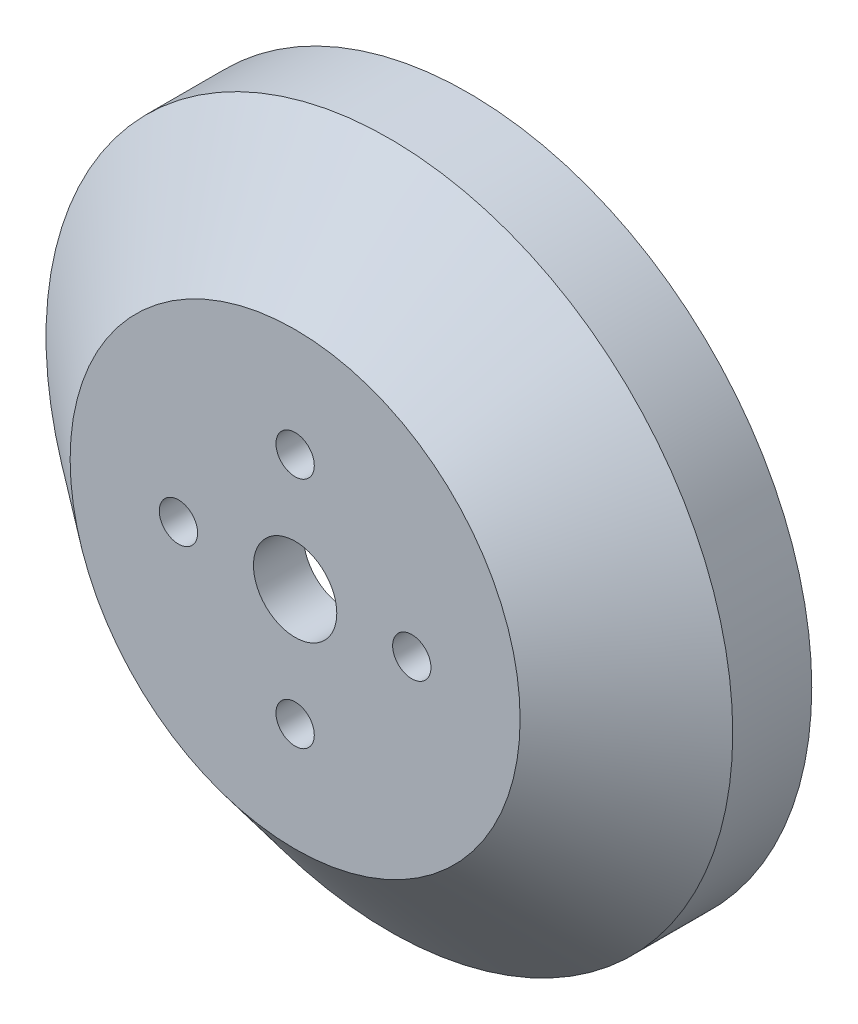
ISO-10303-21;
HEADER;
FILE_DESCRIPTION(('STEP AP214'),'2;1');
FILE_NAME('part.step','',(''),(''),'','','');
FILE_SCHEMA(('AUTOMOTIVE_DESIGN { 1 0 10303 214 1 1 1 1 }'));
ENDSEC;
DATA;
#1=APPLICATION_CONTEXT('core data for automotive mechanical design processes');
#2=APPLICATION_PROTOCOL_DEFINITION('international standard','automotive_design',2000,#1);
#3=PRODUCT_CONTEXT('',#1,'mechanical');
#4=PRODUCT('Part','Part','',(#3));
#5=PRODUCT_RELATED_PRODUCT_CATEGORY('part','',(#4));
#6=PRODUCT_DEFINITION_FORMATION('','',#4);
#7=PRODUCT_DEFINITION_CONTEXT('part definition',#1,'design');
#8=PRODUCT_DEFINITION('design','',#6,#7);
#9=PRODUCT_DEFINITION_SHAPE('','',#8);
#10=(LENGTH_UNIT() NAMED_UNIT(*) SI_UNIT(.MILLI.,.METRE.));
#11=(NAMED_UNIT(*) PLANE_ANGLE_UNIT() SI_UNIT($,.RADIAN.));
#12=(NAMED_UNIT(*) SI_UNIT($,.STERADIAN.) SOLID_ANGLE_UNIT());
#13=UNCERTAINTY_MEASURE_WITH_UNIT(LENGTH_MEASURE(1.E-05),#10,'distance_accuracy_value','');
#14=(GEOMETRIC_REPRESENTATION_CONTEXT(3) GLOBAL_UNCERTAINTY_ASSIGNED_CONTEXT((#13)) GLOBAL_UNIT_ASSIGNED_CONTEXT((#10,
#11,#12)) REPRESENTATION_CONTEXT('',''));
#15=CARTESIAN_POINT('',(0.,0.,0.));
#16=DIRECTION('',(0.,0.,1.));
#17=DIRECTION('',(1.,0.,0.));
#18=AXIS2_PLACEMENT_3D('',#15,#16,#17);
#19=CARTESIAN_POINT('',(0.,0.,3.));
#20=DIRECTION('',(0.,0.,1.));
#21=DIRECTION('',(1.,0.,0.));
#22=AXIS2_PLACEMENT_3D('',#19,#20,#21);
#23=PLANE('',#22);
#24=CARTESIAN_POINT('',(-7.,0.,3.));
#25=DIRECTION('',(0.,0.,1.));
#26=DIRECTION('',(1.,0.,0.));
#27=AXIS2_PLACEMENT_3D('',#24,#25,#26);
#28=CIRCLE('',#27,1.15);
#29=CARTESIAN_POINT('',(-5.85,0.,3.));
#30=VERTEX_POINT('',#29);
#31=EDGE_CURVE('E76',#30,#30,#28,.T.);
#32=ORIENTED_EDGE('',*,*,#31,.F.);
#33=EDGE_LOOP('',(#32));
#34=FACE_BOUND('',#33,.T.);
#35=CARTESIAN_POINT('',(0.,-7.,3.));
#36=DIRECTION('',(0.,0.,1.));
#37=DIRECTION('',(1.,0.,0.));
#38=AXIS2_PLACEMENT_3D('',#35,#36,#37);
#39=CIRCLE('',#38,1.15);
#40=CARTESIAN_POINT('',(1.15,-7.,3.));
#41=VERTEX_POINT('',#40);
#42=EDGE_CURVE('E62',#41,#41,#39,.T.);
#43=ORIENTED_EDGE('',*,*,#42,.F.);
#44=EDGE_LOOP('',(#43));
#45=FACE_BOUND('',#44,.T.);
#46=CARTESIAN_POINT('',(0.,0.,3.));
#47=DIRECTION('',(0.,0.,1.));
#48=DIRECTION('',(1.,0.,0.));
#49=AXIS2_PLACEMENT_3D('',#46,#47,#48);
#50=CIRCLE('',#49,13.5);
#51=CARTESIAN_POINT('',(13.5,0.,3.));
#52=VERTEX_POINT('',#51);
#53=EDGE_CURVE('E111',#52,#52,#50,.T.);
#54=ORIENTED_EDGE('',*,*,#53,.T.);
#55=EDGE_LOOP('',(#54));
#56=FACE_BOUND('',#55,.T.);
#57=CARTESIAN_POINT('',(0.,7.,3.));
#58=DIRECTION('',(0.,0.,1.));
#59=DIRECTION('',(1.,0.,0.));
#60=AXIS2_PLACEMENT_3D('',#57,#58,#59);
#61=CIRCLE('',#60,1.15);
#62=CARTESIAN_POINT('',(1.15,7.,3.));
#63=VERTEX_POINT('',#62);
#64=EDGE_CURVE('E51',#63,#63,#61,.T.);
#65=ORIENTED_EDGE('',*,*,#64,.F.);
#66=EDGE_LOOP('',(#65));
#67=FACE_BOUND('',#66,.T.);
#68=CARTESIAN_POINT('',(7.,0.,3.));
#69=DIRECTION('',(0.,0.,1.));
#70=DIRECTION('',(1.,0.,0.));
#71=AXIS2_PLACEMENT_3D('',#68,#69,#70);
#72=CIRCLE('',#71,1.15);
#73=CARTESIAN_POINT('',(8.15,0.,3.));
#74=VERTEX_POINT('',#73);
#75=EDGE_CURVE('E68',#74,#74,#72,.T.);
#76=ORIENTED_EDGE('',*,*,#75,.F.);
#77=EDGE_LOOP('',(#76));
#78=FACE_BOUND('',#77,.T.);
#79=CARTESIAN_POINT('',(0.,0.,3.));
#80=DIRECTION('',(0.,0.,1.));
#81=DIRECTION('',(1.,0.,0.));
#82=AXIS2_PLACEMENT_3D('',#79,#80,#81);
#83=CIRCLE('',#82,2.5);
#84=CARTESIAN_POINT('',(2.5,0.,3.));
#85=VERTEX_POINT('',#84);
#86=EDGE_CURVE('E84',#85,#85,#83,.T.);
#87=ORIENTED_EDGE('',*,*,#86,.F.);
#88=EDGE_LOOP('',(#87));
#89=FACE_BOUND('',#88,.T.);
#90=ADVANCED_FACE('F43',(#34,#45,#56,#67,#78,#89),#23,.T.);
#91=CARTESIAN_POINT('',(0.,0.,0.));
#92=DIRECTION('',(0.,0.,1.));
#93=DIRECTION('',(1.,0.,0.));
#94=AXIS2_PLACEMENT_3D('',#91,#92,#93);
#95=PLANE('',#94);
#96=CARTESIAN_POINT('',(0.,0.,0.));
#97=DIRECTION('',(0.,0.,1.));
#98=DIRECTION('',(1.,0.,0.));
#99=AXIS2_PLACEMENT_3D('',#96,#97,#98);
#100=CIRCLE('',#99,13.5);
#101=CARTESIAN_POINT('',(13.5,0.,0.));
#102=VERTEX_POINT('',#101);
#103=EDGE_CURVE('E10',#102,#102,#100,.T.);
#104=ORIENTED_EDGE('',*,*,#103,.F.);
#105=EDGE_LOOP('',(#104));
#106=FACE_BOUND('',#105,.T.);
#107=CARTESIAN_POINT('',(0.,7.,0.));
#108=DIRECTION('',(0.,0.,1.));
#109=DIRECTION('',(1.,0.,0.));
#110=AXIS2_PLACEMENT_3D('',#107,#108,#109);
#111=CIRCLE('',#110,1.15);
#112=CARTESIAN_POINT('',(1.15,7.,0.));
#113=VERTEX_POINT('',#112);
#114=EDGE_CURVE('E56',#113,#113,#111,.T.);
#115=ORIENTED_EDGE('',*,*,#114,.T.);
#116=EDGE_LOOP('',(#115));
#117=FACE_BOUND('',#116,.T.);
#118=CARTESIAN_POINT('',(0.,-7.,0.));
#119=DIRECTION('',(0.,0.,1.));
#120=DIRECTION('',(1.,0.,0.));
#121=AXIS2_PLACEMENT_3D('',#118,#119,#120);
#122=CIRCLE('',#121,1.15);
#123=CARTESIAN_POINT('',(1.15,-7.,0.));
#124=VERTEX_POINT('',#123);
#125=EDGE_CURVE('E64',#124,#124,#122,.T.);
#126=ORIENTED_EDGE('',*,*,#125,.T.);
#127=EDGE_LOOP('',(#126));
#128=FACE_BOUND('',#127,.T.);
#129=CARTESIAN_POINT('',(7.,0.,0.));
#130=DIRECTION('',(0.,0.,1.));
#131=DIRECTION('',(1.,0.,0.));
#132=AXIS2_PLACEMENT_3D('',#129,#130,#131);
#133=CIRCLE('',#132,1.15);
#134=CARTESIAN_POINT('',(8.15,0.,0.));
#135=VERTEX_POINT('',#134);
#136=EDGE_CURVE('E72',#135,#135,#133,.T.);
#137=ORIENTED_EDGE('',*,*,#136,.T.);
#138=EDGE_LOOP('',(#137));
#139=FACE_BOUND('',#138,.T.);
#140=CARTESIAN_POINT('',(-7.,0.,0.));
#141=DIRECTION('',(0.,0.,1.));
#142=DIRECTION('',(1.,0.,0.));
#143=AXIS2_PLACEMENT_3D('',#140,#141,#142);
#144=CIRCLE('',#143,1.15);
#145=CARTESIAN_POINT('',(-5.85,0.,0.));
#146=VERTEX_POINT('',#145);
#147=EDGE_CURVE('E80',#146,#146,#144,.T.);
#148=ORIENTED_EDGE('',*,*,#147,.T.);
#149=EDGE_LOOP('',(#148));
#150=FACE_BOUND('',#149,.T.);
#151=CARTESIAN_POINT('',(0.,0.,0.));
#152=DIRECTION('',(0.,0.,1.));
#153=DIRECTION('',(1.,0.,0.));
#154=AXIS2_PLACEMENT_3D('',#151,#152,#153);
#155=CIRCLE('',#154,2.5);
#156=CARTESIAN_POINT('',(2.5,0.,0.));
#157=VERTEX_POINT('',#156);
#158=EDGE_CURVE('E88',#157,#157,#155,.T.);
#159=ORIENTED_EDGE('',*,*,#158,.T.);
#160=EDGE_LOOP('',(#159));
#161=FACE_BOUND('',#160,.T.);
#162=ADVANCED_FACE('F45',(#106,#117,#128,#139,#150,#161),#95,.F.);
#163=CARTESIAN_POINT('',(0.,7.,3.));
#164=DIRECTION('',(0.,0.,-1.));
#165=DIRECTION('',(-1.,0.,0.));
#166=AXIS2_PLACEMENT_3D('',#163,#164,#165);
#167=CYLINDRICAL_SURFACE('',#166,1.15);
#168=ORIENTED_EDGE('',*,*,#64,.T.);
#169=EDGE_LOOP('',(#168));
#170=FACE_BOUND('',#169,.T.);
#171=ORIENTED_EDGE('',*,*,#114,.F.);
#172=EDGE_LOOP('',(#171));
#173=FACE_BOUND('',#172,.T.);
#174=ADVANCED_FACE('F157',(#170,#173),#167,.F.);
#175=CARTESIAN_POINT('',(0.,-7.,3.));
#176=DIRECTION('',(0.,0.,-1.));
#177=DIRECTION('',(-1.,0.,0.));
#178=AXIS2_PLACEMENT_3D('',#175,#176,#177);
#179=CYLINDRICAL_SURFACE('',#178,1.15);
#180=ORIENTED_EDGE('',*,*,#42,.T.);
#181=EDGE_LOOP('',(#180));
#182=FACE_BOUND('',#181,.T.);
#183=ORIENTED_EDGE('',*,*,#125,.F.);
#184=EDGE_LOOP('',(#183));
#185=FACE_BOUND('',#184,.T.);
#186=ADVANCED_FACE('F164',(#182,#185),#179,.F.);
#187=CARTESIAN_POINT('',(7.,0.,3.));
#188=DIRECTION('',(0.,0.,-1.));
#189=DIRECTION('',(-1.,0.,0.));
#190=AXIS2_PLACEMENT_3D('',#187,#188,#189);
#191=CYLINDRICAL_SURFACE('',#190,1.15);
#192=ORIENTED_EDGE('',*,*,#75,.T.);
#193=EDGE_LOOP('',(#192));
#194=FACE_BOUND('',#193,.T.);
#195=ORIENTED_EDGE('',*,*,#136,.F.);
#196=EDGE_LOOP('',(#195));
#197=FACE_BOUND('',#196,.T.);
#198=ADVANCED_FACE('F167',(#194,#197),#191,.F.);
#199=CARTESIAN_POINT('',(-7.,0.,3.));
#200=DIRECTION('',(0.,0.,-1.));
#201=DIRECTION('',(-1.,0.,0.));
#202=AXIS2_PLACEMENT_3D('',#199,#200,#201);
#203=CYLINDRICAL_SURFACE('',#202,1.15);
#204=ORIENTED_EDGE('',*,*,#31,.T.);
#205=EDGE_LOOP('',(#204));
#206=FACE_BOUND('',#205,.T.);
#207=ORIENTED_EDGE('',*,*,#147,.F.);
#208=EDGE_LOOP('',(#207));
#209=FACE_BOUND('',#208,.T.);
#210=ADVANCED_FACE('F149',(#206,#209),#203,.F.);
#211=CARTESIAN_POINT('',(0.,0.,3.));
#212=DIRECTION('',(0.,0.,-1.));
#213=DIRECTION('',(-1.,0.,0.));
#214=AXIS2_PLACEMENT_3D('',#211,#212,#213);
#215=CYLINDRICAL_SURFACE('',#214,2.5);
#216=ORIENTED_EDGE('',*,*,#86,.T.);
#217=EDGE_LOOP('',(#216));
#218=FACE_BOUND('',#217,.T.);
#219=ORIENTED_EDGE('',*,*,#158,.F.);
#220=EDGE_LOOP('',(#219));
#221=FACE_BOUND('',#220,.T.);
#222=ADVANCED_FACE('F144',(#218,#221),#215,.F.);
#223=CARTESIAN_POINT('',(0.,0.,0.));
#224=DIRECTION('',(0.,0.,-1.));
#225=DIRECTION('',(-1.,0.,0.));
#226=AXIS2_PLACEMENT_3D('',#223,#224,#225);
#227=CONICAL_SURFACE('',#226,13.5,0.898194023644503);
#228=CARTESIAN_POINT('',(0.,0.,-4.77899170282317));
#229=DIRECTION('',(0.,0.,1.));
#230=DIRECTION('',(1.,0.,0.));
#231=AXIS2_PLACEMENT_3D('',#228,#229,#230);
#232=CIRCLE('',#231,19.5);
#233=CARTESIAN_POINT('',(19.5,0.,-4.77899170282317));
#234=VERTEX_POINT('',#233);
#235=EDGE_CURVE('E92',#234,#234,#232,.T.);
#236=ORIENTED_EDGE('',*,*,#235,.F.);
#237=EDGE_LOOP('',(#236));
#238=FACE_BOUND('',#237,.T.);
#239=ORIENTED_EDGE('',*,*,#103,.T.);
#240=EDGE_LOOP('',(#239));
#241=FACE_BOUND('',#240,.T.);
#242=ADVANCED_FACE('F139',(#238,#241),#227,.F.);
#243=CARTESIAN_POINT('',(0.,0.,0.));
#244=DIRECTION('',(0.,0.,1.));
#245=DIRECTION('',(1.,0.,0.));
#246=AXIS2_PLACEMENT_3D('',#243,#244,#245);
#247=CYLINDRICAL_SURFACE('',#246,19.5);
#248=CARTESIAN_POINT('',(0.,0.,-7.39719448040469));
#249=DIRECTION('',(0.,0.,1.));
#250=DIRECTION('',(1.,0.,0.));
#251=AXIS2_PLACEMENT_3D('',#248,#249,#250);
#252=CIRCLE('',#251,19.5);
#253=CARTESIAN_POINT('',(19.5,0.,-7.39719448040469));
#254=VERTEX_POINT('',#253);
#255=EDGE_CURVE('E99',#254,#254,#252,.T.);
#256=ORIENTED_EDGE('',*,*,#255,.F.);
#257=EDGE_LOOP('',(#256));
#258=FACE_BOUND('',#257,.T.);
#259=ORIENTED_EDGE('',*,*,#235,.T.);
#260=EDGE_LOOP('',(#259));
#261=FACE_BOUND('',#260,.T.);
#262=ADVANCED_FACE('F133',(#258,#261),#247,.F.);
#263=CARTESIAN_POINT('',(0.,20.6013215122433,-7.39719448040469));
#264=DIRECTION('',(0.,0.,1.));
#265=DIRECTION('',(1.,0.,0.));
#266=AXIS2_PLACEMENT_3D('',#263,#264,#265);
#267=PLANE('',#266);
#268=CARTESIAN_POINT('',(0.,0.,-7.39719448040469));
#269=DIRECTION('',(0.,0.,1.));
#270=DIRECTION('',(1.,0.,0.));
#271=AXIS2_PLACEMENT_3D('',#268,#269,#270);
#272=CIRCLE('',#271,20.6013215122433);
#273=CARTESIAN_POINT('',(20.6013215122433,0.,-7.39719448040469));
#274=VERTEX_POINT('',#273);
#275=EDGE_CURVE('E103',#274,#274,#272,.T.);
#276=ORIENTED_EDGE('',*,*,#275,.F.);
#277=EDGE_LOOP('',(#276));
#278=FACE_BOUND('',#277,.T.);
#279=ORIENTED_EDGE('',*,*,#255,.T.);
#280=EDGE_LOOP('',(#279));
#281=FACE_BOUND('',#280,.T.);
#282=ADVANCED_FACE('F127',(#278,#281),#267,.F.);
#283=CARTESIAN_POINT('',(0.,0.,0.));
#284=DIRECTION('',(0.,0.,1.));
#285=DIRECTION('',(1.,0.,0.));
#286=AXIS2_PLACEMENT_3D('',#283,#284,#285);
#287=CYLINDRICAL_SURFACE('',#286,20.6013215122433);
#288=CARTESIAN_POINT('',(0.,0.,-2.65619276434843));
#289=DIRECTION('',(0.,0.,1.));
#290=DIRECTION('',(1.,0.,0.));
#291=AXIS2_PLACEMENT_3D('',#288,#289,#290);
#292=CIRCLE('',#291,20.6013215122433);
#293=CARTESIAN_POINT('',(20.6013215122433,0.,-2.65619276434843));
#294=VERTEX_POINT('',#293);
#295=EDGE_CURVE('E107',#294,#294,#292,.T.);
#296=ORIENTED_EDGE('',*,*,#295,.F.);
#297=EDGE_LOOP('',(#296));
#298=FACE_BOUND('',#297,.T.);
#299=ORIENTED_EDGE('',*,*,#275,.T.);
#300=EDGE_LOOP('',(#299));
#301=FACE_BOUND('',#300,.T.);
#302=ADVANCED_FACE('F121',(#298,#301),#287,.T.);
#303=CARTESIAN_POINT('',(0.,0.,-2.65619276434843));
#304=DIRECTION('',(0.,0.,-1.));
#305=DIRECTION('',(-1.,0.,0.));
#306=AXIS2_PLACEMENT_3D('',#303,#304,#305);
#307=CONICAL_SURFACE('',#306,20.6013215122433,0.898194023644503);
#308=ORIENTED_EDGE('',*,*,#53,.F.);
#309=EDGE_LOOP('',(#308));
#310=FACE_BOUND('',#309,.T.);
#311=ORIENTED_EDGE('',*,*,#295,.T.);
#312=EDGE_LOOP('',(#311));
#313=FACE_BOUND('',#312,.T.);
#314=ADVANCED_FACE('F118',(#310,#313),#307,.T.);
#315=CLOSED_SHELL('',(#90,#162,#174,#186,#198,#210,#222,#242,#262,#282,#302,#314));
#316=MANIFOLD_SOLID_BREP('B2',#315);
#317=ADVANCED_BREP_SHAPE_REPRESENTATION('',(#18,#316),#14);
#318=SHAPE_DEFINITION_REPRESENTATION(#9,#317);
ENDSEC;
END-ISO-10303-21;
